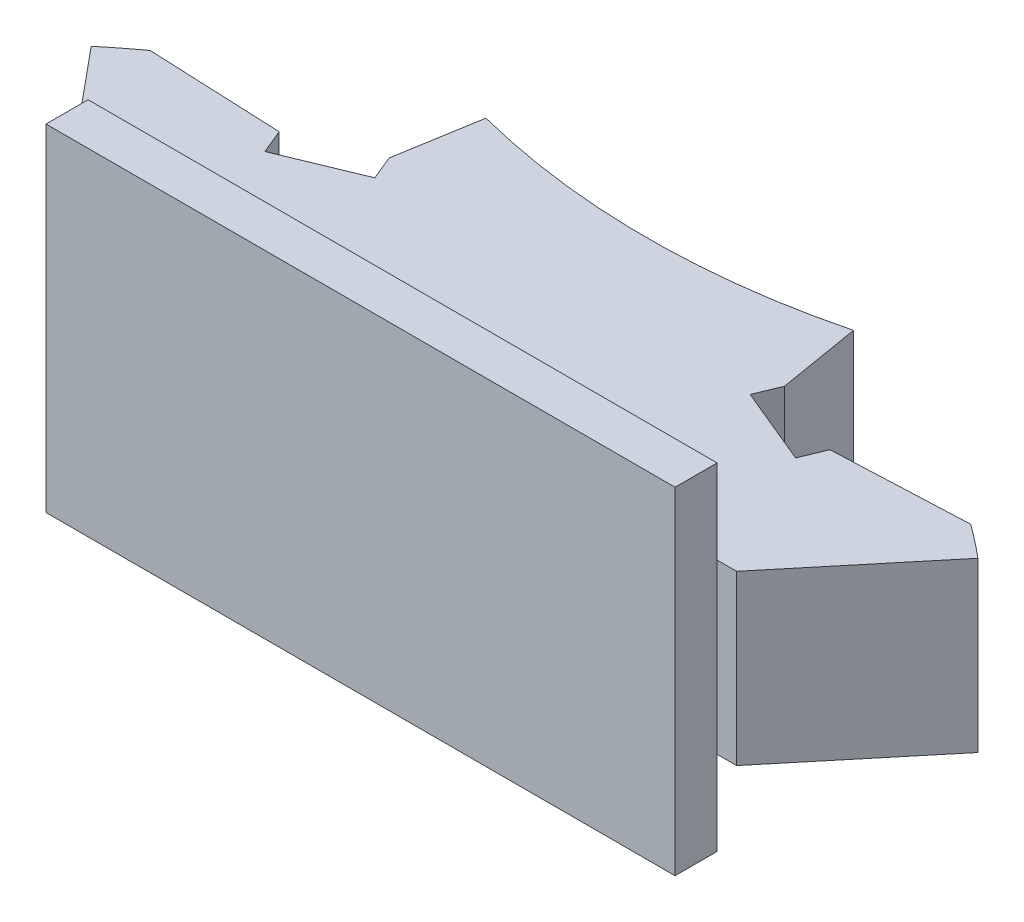
ISO-10303-21;
HEADER;
FILE_DESCRIPTION(('STEP AP214'),'2;1');
FILE_NAME('part.step','',(''),(''),'','','');
FILE_SCHEMA(('AUTOMOTIVE_DESIGN { 1 0 10303 214 1 1 1 1 }'));
ENDSEC;
DATA;
#1=APPLICATION_CONTEXT('core data for automotive mechanical design processes');
#2=APPLICATION_PROTOCOL_DEFINITION('international standard','automotive_design',2000,#1);
#3=PRODUCT_CONTEXT('',#1,'mechanical');
#4=PRODUCT('Part','Part','',(#3));
#5=PRODUCT_RELATED_PRODUCT_CATEGORY('part','',(#4));
#6=PRODUCT_DEFINITION_FORMATION('','',#4);
#7=PRODUCT_DEFINITION_CONTEXT('part definition',#1,'design');
#8=PRODUCT_DEFINITION('design','',#6,#7);
#9=PRODUCT_DEFINITION_SHAPE('','',#8);
#10=(LENGTH_UNIT() NAMED_UNIT(*) SI_UNIT(.MILLI.,.METRE.));
#11=(NAMED_UNIT(*) PLANE_ANGLE_UNIT() SI_UNIT($,.RADIAN.));
#12=(NAMED_UNIT(*) SI_UNIT($,.STERADIAN.) SOLID_ANGLE_UNIT());
#13=UNCERTAINTY_MEASURE_WITH_UNIT(LENGTH_MEASURE(1.E-05),#10,'distance_accuracy_value','');
#14=(GEOMETRIC_REPRESENTATION_CONTEXT(3) GLOBAL_UNCERTAINTY_ASSIGNED_CONTEXT((#13)) GLOBAL_UNIT_ASSIGNED_CONTEXT((#10,
#11,#12)) REPRESENTATION_CONTEXT('',''));
#15=CARTESIAN_POINT('',(0.,0.,0.));
#16=DIRECTION('',(0.,0.,1.));
#17=DIRECTION('',(1.,0.,0.));
#18=AXIS2_PLACEMENT_3D('',#15,#16,#17);
#19=CARTESIAN_POINT('',(-115.533621356237,0.,0.));
#20=DIRECTION('',(0.,1.,0.));
#21=DIRECTION('',(0.,0.,1.));
#22=AXIS2_PLACEMENT_3D('',#19,#20,#21);
#23=PLANE('',#22);
#24=DIRECTION('',(1.,0.,0.));
#25=VECTOR('',#24,1.);
#26=CARTESIAN_POINT('',(-115.533621356237,0.,-30.4184296922719));
#27=LINE('',#26,#25);
#28=CARTESIAN_POINT('',(-25.2117383763098,0.,-30.4184296922719));
#29=VERTEX_POINT('',#28);
#30=CARTESIAN_POINT('',(-23.7417354028187,0.,-30.4184296922719));
#31=VERTEX_POINT('',#30);
#32=EDGE_CURVE('E219',#29,#31,#27,.T.);
#33=ORIENTED_EDGE('',*,*,#32,.T.);
#34=DIRECTION('',(1.,0.,0.));
#35=VECTOR('',#34,1.);
#36=CARTESIAN_POINT('',(-115.533621356237,0.,-30.4184296922719));
#37=LINE('',#36,#35);
#38=CARTESIAN_POINT('',(23.7417354028187,0.,-30.4184296922719));
#39=VERTEX_POINT('',#38);
#40=EDGE_CURVE('E359',#31,#39,#37,.T.);
#41=ORIENTED_EDGE('',*,*,#40,.T.);
#42=CARTESIAN_POINT('',(25.2117383763098,0.,-30.4184296922719));
#43=VERTEX_POINT('',#42);
#44=EDGE_CURVE('E210',#39,#43,#27,.T.);
#45=ORIENTED_EDGE('',*,*,#44,.T.);
#46=DIRECTION('',(0.638136368104806,0.,-0.76992335703108));
#47=VECTOR('',#46,1.);
#48=CARTESIAN_POINT('',(-47.0473730286792,0.,56.7635276599454));
#49=LINE('',#48,#47);
#50=CARTESIAN_POINT('',(33.4708906434651,0.,-40.3832499996372));
#51=VERTEX_POINT('',#50);
#52=EDGE_CURVE('E213',#43,#51,#49,.T.);
#53=ORIENTED_EDGE('',*,*,#52,.T.);
#54=CARTESIAN_POINT('',(0.,0.,0.));
#55=DIRECTION('',(0.,1.,0.));
#56=DIRECTION('',(0.,0.,1.));
#57=AXIS2_PLACEMENT_3D('',#54,#55,#56);
#58=CIRCLE('',#57,52.451);
#59=CARTESIAN_POINT('',(30.9661817647511,0.,-42.3344184784957));
#60=VERTEX_POINT('',#59);
#61=EDGE_CURVE('E262',#51,#60,#58,.T.);
#62=ORIENTED_EDGE('',*,*,#61,.T.);
#63=DIRECTION('',(0.999048221581858,0.,-0.0436193873653331));
#64=VECTOR('',#63,1.);
#65=CARTESIAN_POINT('',(-117.099727209191,0.,-35.8697212800879));
#66=LINE('',#65,#64);
#67=CARTESIAN_POINT('',(20.788013818679,0.,-41.890030068889));
#68=VERTEX_POINT('',#67);
#69=EDGE_CURVE('E260',#68,#60,#66,.T.);
#70=ORIENTED_EDGE('',*,*,#69,.F.);
#71=DIRECTION('',(-0.382683432365091,0.,0.923879532511286));
#72=VECTOR('',#71,1.);
#73=CARTESIAN_POINT('',(-13.9861896043783,0.,42.0623234557764));
#74=LINE('',#73,#72);
#75=CARTESIAN_POINT('',(20.0298414024773,0.,-40.0596399390777));
#76=VERTEX_POINT('',#75);
#77=EDGE_CURVE('E257',#68,#76,#74,.T.);
#78=ORIENTED_EDGE('',*,*,#77,.T.);
#79=DIRECTION('',(0.923879532511286,0.,0.382683432365091));
#80=VECTOR('',#79,1.);
#81=CARTESIAN_POINT('',(-81.5175903493817,0.,-82.1219633948541));
#82=LINE('',#81,#80);
#83=CARTESIAN_POINT('',(14.1632063710306,0.,-42.489679734596));
#84=VERTEX_POINT('',#83);
#85=EDGE_CURVE('E255',#84,#76,#82,.T.);
#86=ORIENTED_EDGE('',*,*,#85,.F.);
#87=DIRECTION('',(-0.382683432365091,0.,0.923879532511286));
#88=VECTOR('',#87,1.);
#89=CARTESIAN_POINT('',(-19.8528246358249,0.,39.6322836602581));
#90=LINE('',#89,#88);
#91=CARTESIAN_POINT('',(14.9213787872323,0.,-44.3200698644074));
#92=VERTEX_POINT('',#91);
#93=EDGE_CURVE('E172',#92,#84,#90,.T.);
#94=ORIENTED_EDGE('',*,*,#93,.F.);
#95=DIRECTION('',(-0.165047605860678,0.,-0.986285601537231));
#96=VECTOR('',#95,1.);
#97=CARTESIAN_POINT('',(18.5822933488122,0.,-22.4433070860841));
#98=LINE('',#97,#96);
#99=CARTESIAN_POINT('',(13.873326490017,0.,-50.5829834341688));
#100=VERTEX_POINT('',#99);
#101=EDGE_CURVE('E251',#92,#100,#98,.T.);
#102=ORIENTED_EDGE('',*,*,#101,.T.);
#103=CARTESIAN_POINT('',(0.,0.,-104.713429692272));
#104=DIRECTION('',(0.,1.,0.));
#105=DIRECTION('',(0.,0.,1.));
#106=AXIS2_PLACEMENT_3D('',#103,#104,#105);
#107=CIRCLE('',#106,55.88);
#108=CARTESIAN_POINT('',(-13.873326490017,0.,-50.5829834341688));
#109=VERTEX_POINT('',#108);
#110=EDGE_CURVE('E188',#109,#100,#107,.T.);
#111=ORIENTED_EDGE('',*,*,#110,.F.);
#112=DIRECTION('',(0.165047605860678,0.,-0.986285601537231));
#113=VECTOR('',#112,1.);
#114=CARTESIAN_POINT('',(-24.8767296064692,0.,15.170760796618));
#115=LINE('',#114,#113);
#116=CARTESIAN_POINT('',(-14.9213787872323,0.,-44.3200698644074));
#117=VERTEX_POINT('',#116);
#118=EDGE_CURVE('E190',#117,#109,#115,.T.);
#119=ORIENTED_EDGE('',*,*,#118,.F.);
#120=DIRECTION('',(0.382683432365091,0.,0.923879532511286));
#121=VECTOR('',#120,1.);
#122=CARTESIAN_POINT('',(-13.9861896043782,0.,-42.0623234557764));
#123=LINE('',#122,#121);
#124=CARTESIAN_POINT('',(-14.1632063710306,0.,-42.489679734596));
#125=VERTEX_POINT('',#124);
#126=EDGE_CURVE('E193',#117,#125,#123,.T.);
#127=ORIENTED_EDGE('',*,*,#126,.T.);
#128=DIRECTION('',(0.923879532511287,0.,-0.382683432365091));
#129=VECTOR('',#128,1.);
#130=CARTESIAN_POINT('',(-115.71063812289,0.,-0.427356278819604));
#131=LINE('',#130,#129);
#132=CARTESIAN_POINT('',(-20.0298414024773,0.,-40.0596399390777));
#133=VERTEX_POINT('',#132);
#134=EDGE_CURVE('E196',#133,#125,#131,.T.);
#135=ORIENTED_EDGE('',*,*,#134,.F.);
#136=DIRECTION('',(0.382683432365091,0.,0.923879532511286));
#137=VECTOR('',#136,1.);
#138=CARTESIAN_POINT('',(-19.8528246358249,0.,-39.6322836602581));
#139=LINE('',#138,#137);
#140=CARTESIAN_POINT('',(-20.788013818679,0.,-41.890030068889));
#141=VERTEX_POINT('',#140);
#142=EDGE_CURVE('E199',#141,#133,#139,.T.);
#143=ORIENTED_EDGE('',*,*,#142,.F.);
#144=DIRECTION('',(-0.999048221581858,0.,-0.0436193873653338));
#145=VECTOR('',#144,1.);
#146=CARTESIAN_POINT('',(-113.527875193469,0.,-45.9391398617168));
#147=LINE('',#146,#145);
#148=CARTESIAN_POINT('',(-30.9661817647511,0.,-42.3344184784957));
#149=VERTEX_POINT('',#148);
#150=EDGE_CURVE('E201',#141,#149,#147,.T.);
#151=ORIENTED_EDGE('',*,*,#150,.T.);
#152=CARTESIAN_POINT('',(0.,0.,0.));
#153=DIRECTION('',(0.,1.,0.));
#154=DIRECTION('',(0.,0.,1.));
#155=AXIS2_PLACEMENT_3D('',#152,#153,#154);
#156=CIRCLE('',#155,52.451);
#157=CARTESIAN_POINT('',(-33.4708906434651,0.,-40.3832499996372));
#158=VERTEX_POINT('',#157);
#159=EDGE_CURVE('E204',#149,#158,#156,.T.);
#160=ORIENTED_EDGE('',*,*,#159,.T.);
#161=DIRECTION('',(-0.638136368104805,0.,-0.769923357031081));
#162=VECTOR('',#161,1.);
#163=CARTESIAN_POINT('',(-47.0473730286791,0.,-56.7635276599454));
#164=LINE('',#163,#162);
#165=EDGE_CURVE('E207',#29,#158,#164,.T.);
#166=ORIENTED_EDGE('',*,*,#165,.F.);
#167=EDGE_LOOP('',(#33,#41,#45,#53,#62,#70,#78,#86,#94,#102,#111,#119,#127,#135,#143,#151,#160,#166));
#168=FACE_BOUND('',#167,.T.);
#169=ADVANCED_FACE('F35',(#168),#23,.T.);
#170=CARTESIAN_POINT('',(-115.533621356237,-12.7,-30.4184296922719));
#171=DIRECTION('',(0.,0.,1.));
#172=DIRECTION('',(1.,0.,0.));
#173=AXIS2_PLACEMENT_3D('',#170,#171,#172);
#174=PLANE('',#173);
#175=DIRECTION('',(1.,0.,0.));
#176=VECTOR('',#175,1.);
#177=CARTESIAN_POINT('',(-115.533621356237,-12.7,-30.4184296922719));
#178=LINE('',#177,#176);
#179=CARTESIAN_POINT('',(-25.2117383763098,-12.7,-30.4184296922719));
#180=VERTEX_POINT('',#179);
#181=CARTESIAN_POINT('',(-23.7417354028187,-12.7,-30.4184296922719));
#182=VERTEX_POINT('',#181);
#183=EDGE_CURVE('E390',#180,#182,#178,.T.);
#184=ORIENTED_EDGE('',*,*,#183,.T.);
#185=DIRECTION('',(0.,1.,0.));
#186=VECTOR('',#185,1.);
#187=CARTESIAN_POINT('',(-23.7417354028187,-19.05,-30.4184296922719));
#188=LINE('',#187,#186);
#189=EDGE_CURVE('E45',#182,#31,#188,.T.);
#190=ORIENTED_EDGE('',*,*,#189,.T.);
#191=ORIENTED_EDGE('',*,*,#32,.F.);
#192=DIRECTION('',(0.,1.,0.));
#193=VECTOR('',#192,1.);
#194=CARTESIAN_POINT('',(-25.2117383763098,-12.7,-30.4184296922719));
#195=LINE('',#194,#193);
#196=EDGE_CURVE('E237',#180,#29,#195,.T.);
#197=ORIENTED_EDGE('',*,*,#196,.F.);
#198=EDGE_LOOP('',(#184,#190,#191,#197));
#199=FACE_BOUND('',#198,.T.);
#200=ADVANCED_FACE('F298',(#199),#174,.T.);
#201=CARTESIAN_POINT('',(0.,-12.7,-104.713429692272));
#202=DIRECTION('',(0.,1.,0.));
#203=DIRECTION('',(0.,0.,1.));
#204=AXIS2_PLACEMENT_3D('',#201,#202,#203);
#205=CYLINDRICAL_SURFACE('',#204,55.88);
#206=ORIENTED_EDGE('',*,*,#110,.T.);
#207=DIRECTION('',(0.,1.,0.));
#208=VECTOR('',#207,1.);
#209=CARTESIAN_POINT('',(13.873326490017,-12.7,-50.5829834341688));
#210=LINE('',#209,#208);
#211=CARTESIAN_POINT('',(13.873326490017,-12.7,-50.5829834341688));
#212=VERTEX_POINT('',#211);
#213=EDGE_CURVE('E114',#212,#100,#210,.T.);
#214=ORIENTED_EDGE('',*,*,#213,.F.);
#215=CARTESIAN_POINT('',(0.,-12.7,-104.713429692272));
#216=DIRECTION('',(0.,1.,0.));
#217=DIRECTION('',(0.,0.,1.));
#218=AXIS2_PLACEMENT_3D('',#215,#216,#217);
#219=CIRCLE('',#218,55.88);
#220=CARTESIAN_POINT('',(-13.873326490017,-12.7,-50.5829834341688));
#221=VERTEX_POINT('',#220);
#222=EDGE_CURVE('E54',#221,#212,#219,.T.);
#223=ORIENTED_EDGE('',*,*,#222,.F.);
#224=DIRECTION('',(0.,1.,0.));
#225=VECTOR('',#224,1.);
#226=CARTESIAN_POINT('',(-13.873326490017,-12.7,-50.5829834341688));
#227=LINE('',#226,#225);
#228=EDGE_CURVE('E187',#221,#109,#227,.T.);
#229=ORIENTED_EDGE('',*,*,#228,.T.);
#230=EDGE_LOOP('',(#206,#214,#223,#229));
#231=FACE_BOUND('',#230,.T.);
#232=ADVANCED_FACE('F37',(#231),#205,.F.);
#233=CARTESIAN_POINT('',(18.5822933488122,-12.7,-22.4433070860841));
#234=DIRECTION('',(0.986285601537231,0.,-0.165047605860678));
#235=DIRECTION('',(-0.165047605860678,0.,-0.986285601537231));
#236=AXIS2_PLACEMENT_3D('',#233,#234,#235);
#237=PLANE('',#236);
#238=ORIENTED_EDGE('',*,*,#101,.F.);
#239=DIRECTION('',(0.,1.,0.));
#240=VECTOR('',#239,1.);
#241=CARTESIAN_POINT('',(14.9213787872323,-12.7,-44.3200698644074));
#242=LINE('',#241,#240);
#243=CARTESIAN_POINT('',(14.9213787872323,-12.7,-44.3200698644074));
#244=VERTEX_POINT('',#243);
#245=EDGE_CURVE('E107',#244,#92,#242,.T.);
#246=ORIENTED_EDGE('',*,*,#245,.F.);
#247=DIRECTION('',(-0.165047605860678,0.,-0.986285601537231));
#248=VECTOR('',#247,1.);
#249=CARTESIAN_POINT('',(18.5822933488122,-12.7,-22.4433070860841));
#250=LINE('',#249,#248);
#251=EDGE_CURVE('E167',#244,#212,#250,.T.);
#252=ORIENTED_EDGE('',*,*,#251,.T.);
#253=ORIENTED_EDGE('',*,*,#213,.T.);
#254=EDGE_LOOP('',(#238,#246,#252,#253));
#255=FACE_BOUND('',#254,.T.);
#256=ADVANCED_FACE('F290',(#255),#237,.T.);
#257=CARTESIAN_POINT('',(-19.8528246358249,-12.7,39.6322836602581));
#258=DIRECTION('',(-0.923879532511286,0.,-0.382683432365091));
#259=DIRECTION('',(-0.382683432365091,0.,0.923879532511286));
#260=AXIS2_PLACEMENT_3D('',#257,#258,#259);
#261=PLANE('',#260);
#262=ORIENTED_EDGE('',*,*,#93,.T.);
#263=DIRECTION('',(0.,1.,0.));
#264=VECTOR('',#263,1.);
#265=CARTESIAN_POINT('',(14.1632063710306,-12.7,-42.489679734596));
#266=LINE('',#265,#264);
#267=CARTESIAN_POINT('',(14.1632063710306,-12.7,-42.489679734596));
#268=VERTEX_POINT('',#267);
#269=EDGE_CURVE('E170',#268,#84,#266,.T.);
#270=ORIENTED_EDGE('',*,*,#269,.F.);
#271=DIRECTION('',(-0.382683432365091,0.,0.923879532511286));
#272=VECTOR('',#271,1.);
#273=CARTESIAN_POINT('',(-19.8528246358249,-12.7,39.6322836602581));
#274=LINE('',#273,#272);
#275=EDGE_CURVE('E160',#244,#268,#274,.T.);
#276=ORIENTED_EDGE('',*,*,#275,.F.);
#277=ORIENTED_EDGE('',*,*,#245,.T.);
#278=EDGE_LOOP('',(#262,#270,#276,#277));
#279=FACE_BOUND('',#278,.T.);
#280=ADVANCED_FACE('F171',(#279),#261,.F.);
#281=CARTESIAN_POINT('',(-81.5175903493817,-12.7,-82.1219633948541));
#282=DIRECTION('',(-0.382683432365091,0.,0.923879532511286));
#283=DIRECTION('',(0.923879532511286,0.,0.382683432365091));
#284=AXIS2_PLACEMENT_3D('',#281,#282,#283);
#285=PLANE('',#284);
#286=ORIENTED_EDGE('',*,*,#85,.T.);
#287=DIRECTION('',(0.,1.,0.));
#288=VECTOR('',#287,1.);
#289=CARTESIAN_POINT('',(20.0298414024773,-12.7,-40.0596399390777));
#290=LINE('',#289,#288);
#291=CARTESIAN_POINT('',(20.0298414024773,-12.7,-40.0596399390777));
#292=VERTEX_POINT('',#291);
#293=EDGE_CURVE('E176',#292,#76,#290,.T.);
#294=ORIENTED_EDGE('',*,*,#293,.F.);
#295=DIRECTION('',(0.923879532511286,0.,0.382683432365091));
#296=VECTOR('',#295,1.);
#297=CARTESIAN_POINT('',(-81.5175903493817,-12.7,-82.1219633948541));
#298=LINE('',#297,#296);
#299=EDGE_CURVE('E165',#268,#292,#298,.T.);
#300=ORIENTED_EDGE('',*,*,#299,.F.);
#301=ORIENTED_EDGE('',*,*,#269,.T.);
#302=EDGE_LOOP('',(#286,#294,#300,#301));
#303=FACE_BOUND('',#302,.T.);
#304=ADVANCED_FACE('F178',(#303),#285,.F.);
#305=CARTESIAN_POINT('',(-13.9861896043783,-12.7,42.0623234557764));
#306=DIRECTION('',(-0.923879532511286,0.,-0.382683432365091));
#307=DIRECTION('',(-0.382683432365091,0.,0.923879532511286));
#308=AXIS2_PLACEMENT_3D('',#305,#306,#307);
#309=PLANE('',#308);
#310=ORIENTED_EDGE('',*,*,#77,.F.);
#311=DIRECTION('',(0.,1.,0.));
#312=VECTOR('',#311,1.);
#313=CARTESIAN_POINT('',(20.788013818679,-12.7,-41.890030068889));
#314=LINE('',#313,#312);
#315=CARTESIAN_POINT('',(20.788013818679,-12.7,-41.890030068889));
#316=VERTEX_POINT('',#315);
#317=EDGE_CURVE('E246',#316,#68,#314,.T.);
#318=ORIENTED_EDGE('',*,*,#317,.F.);
#319=DIRECTION('',(-0.382683432365091,0.,0.923879532511286));
#320=VECTOR('',#319,1.);
#321=CARTESIAN_POINT('',(-13.9861896043783,-12.7,42.0623234557764));
#322=LINE('',#321,#320);
#323=EDGE_CURVE('E180',#316,#292,#322,.T.);
#324=ORIENTED_EDGE('',*,*,#323,.T.);
#325=ORIENTED_EDGE('',*,*,#293,.T.);
#326=EDGE_LOOP('',(#310,#318,#324,#325));
#327=FACE_BOUND('',#326,.T.);
#328=ADVANCED_FACE('F288',(#327),#309,.T.);
#329=CARTESIAN_POINT('',(-117.099727209191,-12.7,-35.8697212800879));
#330=DIRECTION('',(0.0436193873653331,0.,0.999048221581858));
#331=DIRECTION('',(0.999048221581858,0.,-0.0436193873653331));
#332=AXIS2_PLACEMENT_3D('',#329,#330,#331);
#333=PLANE('',#332);
#334=ORIENTED_EDGE('',*,*,#69,.T.);
#335=DIRECTION('',(0.,1.,0.));
#336=VECTOR('',#335,1.);
#337=CARTESIAN_POINT('',(30.9661817647511,-12.7,-42.3344184784957));
#338=LINE('',#337,#336);
#339=CARTESIAN_POINT('',(30.9661817647511,-12.7,-42.3344184784957));
#340=VERTEX_POINT('',#339);
#341=EDGE_CURVE('E244',#340,#60,#338,.T.);
#342=ORIENTED_EDGE('',*,*,#341,.F.);
#343=DIRECTION('',(0.999048221581858,0.,-0.0436193873653331));
#344=VECTOR('',#343,1.);
#345=CARTESIAN_POINT('',(-117.099727209191,-12.7,-35.8697212800879));
#346=LINE('',#345,#344);
#347=EDGE_CURVE('E182',#316,#340,#346,.T.);
#348=ORIENTED_EDGE('',*,*,#347,.F.);
#349=ORIENTED_EDGE('',*,*,#317,.T.);
#350=EDGE_LOOP('',(#334,#342,#348,#349));
#351=FACE_BOUND('',#350,.T.);
#352=ADVANCED_FACE('F285',(#351),#333,.F.);
#353=CARTESIAN_POINT('',(0.,-12.7,0.));
#354=DIRECTION('',(0.,1.,0.));
#355=DIRECTION('',(0.,0.,1.));
#356=AXIS2_PLACEMENT_3D('',#353,#354,#355);
#357=CYLINDRICAL_SURFACE('',#356,52.451);
#358=ORIENTED_EDGE('',*,*,#61,.F.);
#359=DIRECTION('',(0.,1.,0.));
#360=VECTOR('',#359,1.);
#361=CARTESIAN_POINT('',(33.4708906434651,-12.7,-40.3832499996372));
#362=LINE('',#361,#360);
#363=CARTESIAN_POINT('',(33.4708906434651,-12.7,-40.3832499996372));
#364=VERTEX_POINT('',#363);
#365=EDGE_CURVE('E242',#364,#51,#362,.T.);
#366=ORIENTED_EDGE('',*,*,#365,.F.);
#367=CARTESIAN_POINT('',(0.,-12.7,0.));
#368=DIRECTION('',(0.,1.,0.));
#369=DIRECTION('',(0.,0.,1.));
#370=AXIS2_PLACEMENT_3D('',#367,#368,#369);
#371=CIRCLE('',#370,52.451);
#372=EDGE_CURVE('E282',#364,#340,#371,.T.);
#373=ORIENTED_EDGE('',*,*,#372,.T.);
#374=ORIENTED_EDGE('',*,*,#341,.T.);
#375=EDGE_LOOP('',(#358,#366,#373,#374));
#376=FACE_BOUND('',#375,.T.);
#377=ADVANCED_FACE('F280',(#376),#357,.T.);
#378=CARTESIAN_POINT('',(-47.0473730286792,-12.7,56.7635276599454));
#379=DIRECTION('',(0.76992335703108,0.,0.638136368104805));
#380=DIRECTION('',(0.638136368104805,0.,-0.76992335703108));
#381=AXIS2_PLACEMENT_3D('',#378,#379,#380);
#382=PLANE('',#381);
#383=ORIENTED_EDGE('',*,*,#52,.F.);
#384=DIRECTION('',(0.,1.,0.));
#385=VECTOR('',#384,1.);
#386=CARTESIAN_POINT('',(25.2117383763098,-12.7,-30.4184296922719));
#387=LINE('',#386,#385);
#388=CARTESIAN_POINT('',(25.2117383763098,-12.7,-30.4184296922719));
#389=VERTEX_POINT('',#388);
#390=EDGE_CURVE('E239',#389,#43,#387,.T.);
#391=ORIENTED_EDGE('',*,*,#390,.F.);
#392=DIRECTION('',(0.638136368104806,0.,-0.76992335703108));
#393=VECTOR('',#392,1.);
#394=CARTESIAN_POINT('',(-47.0473730286792,-12.7,56.7635276599454));
#395=LINE('',#394,#393);
#396=EDGE_CURVE('E276',#389,#364,#395,.T.);
#397=ORIENTED_EDGE('',*,*,#396,.T.);
#398=ORIENTED_EDGE('',*,*,#365,.T.);
#399=EDGE_LOOP('',(#383,#391,#397,#398));
#400=FACE_BOUND('',#399,.T.);
#401=ADVANCED_FACE('F273',(#400),#382,.T.);
#402=DIRECTION('',(0.,1.,0.));
#403=VECTOR('',#402,1.);
#404=CARTESIAN_POINT('',(23.7417354028187,-19.05,-30.4184296922719));
#405=LINE('',#404,#403);
#406=CARTESIAN_POINT('',(23.7417354028187,-12.7,-30.4184296922719));
#407=VERTEX_POINT('',#406);
#408=EDGE_CURVE('E11',#407,#39,#405,.T.);
#409=ORIENTED_EDGE('',*,*,#408,.F.);
#410=EDGE_CURVE('E400',#407,#389,#178,.T.);
#411=ORIENTED_EDGE('',*,*,#410,.T.);
#412=ORIENTED_EDGE('',*,*,#390,.T.);
#413=ORIENTED_EDGE('',*,*,#44,.F.);
#414=EDGE_LOOP('',(#409,#411,#412,#413));
#415=FACE_BOUND('',#414,.T.);
#416=ADVANCED_FACE('F307',(#415),#174,.T.);
#417=CARTESIAN_POINT('',(-47.0473730286791,-12.7,-56.7635276599454));
#418=DIRECTION('',(0.76992335703108,0.,-0.638136368104805));
#419=DIRECTION('',(-0.638136368104805,0.,-0.769923357031081));
#420=AXIS2_PLACEMENT_3D('',#417,#418,#419);
#421=PLANE('',#420);
#422=ORIENTED_EDGE('',*,*,#165,.T.);
#423=DIRECTION('',(0.,1.,0.));
#424=VECTOR('',#423,1.);
#425=CARTESIAN_POINT('',(-33.4708906434651,-12.7,-40.3832499996372));
#426=LINE('',#425,#424);
#427=CARTESIAN_POINT('',(-33.4708906434651,-12.7,-40.3832499996372));
#428=VERTEX_POINT('',#427);
#429=EDGE_CURVE('E235',#428,#158,#426,.T.);
#430=ORIENTED_EDGE('',*,*,#429,.F.);
#431=DIRECTION('',(-0.638136368104805,0.,-0.769923357031081));
#432=VECTOR('',#431,1.);
#433=CARTESIAN_POINT('',(-47.0473730286791,-12.7,-56.7635276599454));
#434=LINE('',#433,#432);
#435=EDGE_CURVE('E398',#180,#428,#434,.T.);
#436=ORIENTED_EDGE('',*,*,#435,.F.);
#437=ORIENTED_EDGE('',*,*,#196,.T.);
#438=EDGE_LOOP('',(#422,#430,#436,#437));
#439=FACE_BOUND('',#438,.T.);
#440=ADVANCED_FACE('F395',(#439),#421,.F.);
#441=CARTESIAN_POINT('',(0.,-12.7,0.));
#442=DIRECTION('',(0.,1.,0.));
#443=DIRECTION('',(0.,0.,1.));
#444=AXIS2_PLACEMENT_3D('',#441,#442,#443);
#445=CYLINDRICAL_SURFACE('',#444,52.451);
#446=ORIENTED_EDGE('',*,*,#159,.F.);
#447=DIRECTION('',(0.,1.,0.));
#448=VECTOR('',#447,1.);
#449=CARTESIAN_POINT('',(-30.9661817647511,-12.7,-42.3344184784957));
#450=LINE('',#449,#448);
#451=CARTESIAN_POINT('',(-30.9661817647511,-12.7,-42.3344184784957));
#452=VERTEX_POINT('',#451);
#453=EDGE_CURVE('E233',#452,#149,#450,.T.);
#454=ORIENTED_EDGE('',*,*,#453,.F.);
#455=CARTESIAN_POINT('',(0.,-12.7,0.));
#456=DIRECTION('',(0.,1.,0.));
#457=DIRECTION('',(0.,0.,1.));
#458=AXIS2_PLACEMENT_3D('',#455,#456,#457);
#459=CIRCLE('',#458,52.451);
#460=EDGE_CURVE('E401',#452,#428,#459,.T.);
#461=ORIENTED_EDGE('',*,*,#460,.T.);
#462=ORIENTED_EDGE('',*,*,#429,.T.);
#463=EDGE_LOOP('',(#446,#454,#461,#462));
#464=FACE_BOUND('',#463,.T.);
#465=ADVANCED_FACE('F458',(#464),#445,.T.);
#466=CARTESIAN_POINT('',(-113.527875193469,-12.7,-45.9391398617168));
#467=DIRECTION('',(0.0436193873653338,0.,-0.999048221581858));
#468=DIRECTION('',(-0.999048221581858,0.,-0.0436193873653338));
#469=AXIS2_PLACEMENT_3D('',#466,#467,#468);
#470=PLANE('',#469);
#471=ORIENTED_EDGE('',*,*,#150,.F.);
#472=DIRECTION('',(0.,1.,0.));
#473=VECTOR('',#472,1.);
#474=CARTESIAN_POINT('',(-20.788013818679,-12.7,-41.890030068889));
#475=LINE('',#474,#473);
#476=CARTESIAN_POINT('',(-20.788013818679,-12.7,-41.890030068889));
#477=VERTEX_POINT('',#476);
#478=EDGE_CURVE('E231',#477,#141,#475,.T.);
#479=ORIENTED_EDGE('',*,*,#478,.F.);
#480=DIRECTION('',(-0.999048221581858,0.,-0.0436193873653338));
#481=VECTOR('',#480,1.);
#482=CARTESIAN_POINT('',(-113.527875193469,-12.7,-45.9391398617168));
#483=LINE('',#482,#481);
#484=EDGE_CURVE('E454',#477,#452,#483,.T.);
#485=ORIENTED_EDGE('',*,*,#484,.T.);
#486=ORIENTED_EDGE('',*,*,#453,.T.);
#487=EDGE_LOOP('',(#471,#479,#485,#486));
#488=FACE_BOUND('',#487,.T.);
#489=ADVANCED_FACE('F462',(#488),#470,.T.);
#490=CARTESIAN_POINT('',(-19.8528246358249,-12.7,-39.6322836602581));
#491=DIRECTION('',(-0.923879532511286,0.,0.382683432365091));
#492=DIRECTION('',(0.382683432365091,0.,0.923879532511286));
#493=AXIS2_PLACEMENT_3D('',#490,#491,#492);
#494=PLANE('',#493);
#495=ORIENTED_EDGE('',*,*,#142,.T.);
#496=DIRECTION('',(0.,1.,0.));
#497=VECTOR('',#496,1.);
#498=CARTESIAN_POINT('',(-20.0298414024773,-12.7,-40.0596399390777));
#499=LINE('',#498,#497);
#500=CARTESIAN_POINT('',(-20.0298414024773,-12.7,-40.0596399390777));
#501=VERTEX_POINT('',#500);
#502=EDGE_CURVE('E228',#501,#133,#499,.T.);
#503=ORIENTED_EDGE('',*,*,#502,.F.);
#504=DIRECTION('',(0.382683432365091,0.,0.923879532511286));
#505=VECTOR('',#504,1.);
#506=CARTESIAN_POINT('',(-19.8528246358249,-12.7,-39.6322836602581));
#507=LINE('',#506,#505);
#508=EDGE_CURVE('E452',#477,#501,#507,.T.);
#509=ORIENTED_EDGE('',*,*,#508,.F.);
#510=ORIENTED_EDGE('',*,*,#478,.T.);
#511=EDGE_LOOP('',(#495,#503,#509,#510));
#512=FACE_BOUND('',#511,.T.);
#513=ADVANCED_FACE('F467',(#512),#494,.F.);
#514=CARTESIAN_POINT('',(-115.71063812289,-12.7,-0.427356278819604));
#515=DIRECTION('',(0.382683432365091,0.,0.923879532511286));
#516=DIRECTION('',(0.923879532511287,0.,-0.382683432365091));
#517=AXIS2_PLACEMENT_3D('',#514,#515,#516);
#518=PLANE('',#517);
#519=ORIENTED_EDGE('',*,*,#134,.T.);
#520=DIRECTION('',(0.,1.,0.));
#521=VECTOR('',#520,1.);
#522=CARTESIAN_POINT('',(-14.1632063710306,-12.7,-42.489679734596));
#523=LINE('',#522,#521);
#524=CARTESIAN_POINT('',(-14.1632063710306,-12.7,-42.489679734596));
#525=VERTEX_POINT('',#524);
#526=EDGE_CURVE('E226',#525,#125,#523,.T.);
#527=ORIENTED_EDGE('',*,*,#526,.F.);
#528=DIRECTION('',(0.923879532511287,0.,-0.382683432365091));
#529=VECTOR('',#528,1.);
#530=CARTESIAN_POINT('',(-115.71063812289,-12.7,-0.427356278819604));
#531=LINE('',#530,#529);
#532=EDGE_CURVE('E450',#501,#525,#531,.T.);
#533=ORIENTED_EDGE('',*,*,#532,.F.);
#534=ORIENTED_EDGE('',*,*,#502,.T.);
#535=EDGE_LOOP('',(#519,#527,#533,#534));
#536=FACE_BOUND('',#535,.T.);
#537=ADVANCED_FACE('F471',(#536),#518,.F.);
#538=CARTESIAN_POINT('',(-13.9861896043782,-12.7,-42.0623234557764));
#539=DIRECTION('',(-0.923879532511286,0.,0.382683432365091));
#540=DIRECTION('',(0.382683432365091,0.,0.923879532511286));
#541=AXIS2_PLACEMENT_3D('',#538,#539,#540);
#542=PLANE('',#541);
#543=ORIENTED_EDGE('',*,*,#126,.F.);
#544=DIRECTION('',(0.,1.,0.));
#545=VECTOR('',#544,1.);
#546=CARTESIAN_POINT('',(-14.9213787872323,-12.7,-44.3200698644074));
#547=LINE('',#546,#545);
#548=CARTESIAN_POINT('',(-14.9213787872323,-12.7,-44.3200698644074));
#549=VERTEX_POINT('',#548);
#550=EDGE_CURVE('E224',#549,#117,#547,.T.);
#551=ORIENTED_EDGE('',*,*,#550,.F.);
#552=DIRECTION('',(0.382683432365091,0.,0.923879532511286));
#553=VECTOR('',#552,1.);
#554=CARTESIAN_POINT('',(-13.9861896043782,-12.7,-42.0623234557764));
#555=LINE('',#554,#553);
#556=EDGE_CURVE('E447',#549,#525,#555,.T.);
#557=ORIENTED_EDGE('',*,*,#556,.T.);
#558=ORIENTED_EDGE('',*,*,#526,.T.);
#559=EDGE_LOOP('',(#543,#551,#557,#558));
#560=FACE_BOUND('',#559,.T.);
#561=ADVANCED_FACE('F475',(#560),#542,.T.);
#562=CARTESIAN_POINT('',(-24.8767296064692,-12.7,15.170760796618));
#563=DIRECTION('',(0.986285601537231,0.,0.165047605860678));
#564=DIRECTION('',(0.165047605860678,0.,-0.986285601537231));
#565=AXIS2_PLACEMENT_3D('',#562,#563,#564);
#566=PLANE('',#565);
#567=ORIENTED_EDGE('',*,*,#118,.T.);
#568=ORIENTED_EDGE('',*,*,#228,.F.);
#569=DIRECTION('',(0.165047605860678,0.,-0.986285601537231));
#570=VECTOR('',#569,1.);
#571=CARTESIAN_POINT('',(-24.8767296064692,-12.7,15.170760796618));
#572=LINE('',#571,#570);
#573=EDGE_CURVE('E120',#549,#221,#572,.T.);
#574=ORIENTED_EDGE('',*,*,#573,.F.);
#575=ORIENTED_EDGE('',*,*,#550,.T.);
#576=EDGE_LOOP('',(#567,#568,#574,#575));
#577=FACE_BOUND('',#576,.T.);
#578=ADVANCED_FACE('F312',(#577),#566,.F.);
#579=CARTESIAN_POINT('',(-115.533621356237,-12.7,0.));
#580=DIRECTION('',(0.,1.,0.));
#581=DIRECTION('',(0.,0.,1.));
#582=AXIS2_PLACEMENT_3D('',#579,#580,#581);
#583=PLANE('',#582);
#584=ORIENTED_EDGE('',*,*,#222,.T.);
#585=ORIENTED_EDGE('',*,*,#251,.F.);
#586=ORIENTED_EDGE('',*,*,#275,.T.);
#587=ORIENTED_EDGE('',*,*,#299,.T.);
#588=ORIENTED_EDGE('',*,*,#323,.F.);
#589=ORIENTED_EDGE('',*,*,#347,.T.);
#590=ORIENTED_EDGE('',*,*,#372,.F.);
#591=ORIENTED_EDGE('',*,*,#396,.F.);
#592=ORIENTED_EDGE('',*,*,#410,.F.);
#593=EDGE_CURVE('E406',#182,#407,#178,.T.);
#594=ORIENTED_EDGE('',*,*,#593,.F.);
#595=ORIENTED_EDGE('',*,*,#183,.F.);
#596=ORIENTED_EDGE('',*,*,#435,.T.);
#597=ORIENTED_EDGE('',*,*,#460,.F.);
#598=ORIENTED_EDGE('',*,*,#484,.F.);
#599=ORIENTED_EDGE('',*,*,#508,.T.);
#600=ORIENTED_EDGE('',*,*,#532,.T.);
#601=ORIENTED_EDGE('',*,*,#556,.F.);
#602=ORIENTED_EDGE('',*,*,#573,.T.);
#603=EDGE_LOOP('',(#584,#585,#586,#587,#588,#589,#590,#591,#592,#594,#595,#596,#597,#598,#599,
#600,#601,#602));
#604=FACE_BOUND('',#603,.T.);
#605=ADVANCED_FACE('F162',(#604),#583,.F.);
#606=CARTESIAN_POINT('',(-115.533621356237,-19.05,-30.4184296922719));
#607=DIRECTION('',(0.,0.,1.));
#608=DIRECTION('',(1.,0.,0.));
#609=AXIS2_PLACEMENT_3D('',#606,#607,#608);
#610=PLANE('',#609);
#611=CARTESIAN_POINT('',(-23.7417354028187,-19.05,-30.4184296922719));
#612=VERTEX_POINT('',#611);
#613=EDGE_CURVE('E191',#612,#182,#188,.T.);
#614=ORIENTED_EDGE('',*,*,#613,.T.);
#615=ORIENTED_EDGE('',*,*,#593,.T.);
#616=CARTESIAN_POINT('',(23.7417354028187,-19.05,-30.4184296922719));
#617=VERTEX_POINT('',#616);
#618=EDGE_CURVE('E437',#617,#407,#405,.T.);
#619=ORIENTED_EDGE('',*,*,#618,.F.);
#620=DIRECTION('',(1.,0.,0.));
#621=VECTOR('',#620,1.);
#622=CARTESIAN_POINT('',(-115.533621356237,-19.05,-30.4184296922719));
#623=LINE('',#622,#621);
#624=EDGE_CURVE('E440',#612,#617,#623,.T.);
#625=ORIENTED_EDGE('',*,*,#624,.F.);
#626=EDGE_LOOP('',(#614,#615,#619,#625));
#627=FACE_BOUND('',#626,.T.);
#628=ADVANCED_FACE('F311',(#627),#610,.F.);
#629=CARTESIAN_POINT('',(-23.7417354028187,-19.05,0.));
#630=DIRECTION('',(-1.,0.,0.));
#631=DIRECTION('',(0.,0.,1.));
#632=AXIS2_PLACEMENT_3D('',#629,#630,#631);
#633=PLANE('',#632);
#634=DIRECTION('',(0.,1.,0.));
#635=VECTOR('',#634,1.);
#636=CARTESIAN_POINT('',(-23.7417354028187,-19.05,-27.2434296922719));
#637=LINE('',#636,#635);
#638=CARTESIAN_POINT('',(-23.7417354028187,-19.05,-27.2434296922719));
#639=VERTEX_POINT('',#638);
#640=CARTESIAN_POINT('',(-23.7417354028187,6.35,-27.2434296922719));
#641=VERTEX_POINT('',#640);
#642=EDGE_CURVE('E438',#639,#641,#637,.T.);
#643=ORIENTED_EDGE('',*,*,#642,.T.);
#644=DIRECTION('',(0.,0.,1.));
#645=VECTOR('',#644,1.);
#646=CARTESIAN_POINT('',(-23.7417354028187,6.35,0.));
#647=LINE('',#646,#645);
#648=CARTESIAN_POINT('',(-23.7417354028187,6.35,-30.4184296922719));
#649=VERTEX_POINT('',#648);
#650=EDGE_CURVE('E346',#649,#641,#647,.T.);
#651=ORIENTED_EDGE('',*,*,#650,.F.);
#652=DIRECTION('',(0.,-1.,0.));
#653=VECTOR('',#652,1.);
#654=CARTESIAN_POINT('',(-23.7417354028187,6.35,-30.4184296922719));
#655=LINE('',#654,#653);
#656=EDGE_CURVE('E367',#649,#31,#655,.T.);
#657=ORIENTED_EDGE('',*,*,#656,.T.);
#658=ORIENTED_EDGE('',*,*,#189,.F.);
#659=ORIENTED_EDGE('',*,*,#613,.F.);
#660=DIRECTION('',(0.,0.,1.));
#661=VECTOR('',#660,1.);
#662=CARTESIAN_POINT('',(-23.7417354028187,-19.05,0.));
#663=LINE('',#662,#661);
#664=EDGE_CURVE('E370',#612,#639,#663,.T.);
#665=ORIENTED_EDGE('',*,*,#664,.T.);
#666=EDGE_LOOP('',(#643,#651,#657,#658,#659,#665));
#667=FACE_BOUND('',#666,.T.);
#668=ADVANCED_FACE('F313',(#667),#633,.T.);
#669=CARTESIAN_POINT('',(23.7417354028187,-19.05,0.));
#670=DIRECTION('',(-1.,0.,0.));
#671=DIRECTION('',(0.,0.,1.));
#672=AXIS2_PLACEMENT_3D('',#669,#670,#671);
#673=PLANE('',#672);
#674=ORIENTED_EDGE('',*,*,#408,.T.);
#675=DIRECTION('',(0.,-1.,0.));
#676=VECTOR('',#675,1.);
#677=CARTESIAN_POINT('',(23.7417354028187,6.35,-30.4184296922719));
#678=LINE('',#677,#676);
#679=CARTESIAN_POINT('',(23.7417354028187,6.35,-30.4184296922719));
#680=VERTEX_POINT('',#679);
#681=EDGE_CURVE('E374',#680,#39,#678,.T.);
#682=ORIENTED_EDGE('',*,*,#681,.F.);
#683=DIRECTION('',(0.,0.,1.));
#684=VECTOR('',#683,1.);
#685=CARTESIAN_POINT('',(23.7417354028187,6.35,0.));
#686=LINE('',#685,#684);
#687=CARTESIAN_POINT('',(23.7417354028187,6.35,-27.2434296922719));
#688=VERTEX_POINT('',#687);
#689=EDGE_CURVE('E361',#680,#688,#686,.T.);
#690=ORIENTED_EDGE('',*,*,#689,.T.);
#691=DIRECTION('',(0.,1.,0.));
#692=VECTOR('',#691,1.);
#693=CARTESIAN_POINT('',(23.7417354028187,-19.05,-27.2434296922719));
#694=LINE('',#693,#692);
#695=CARTESIAN_POINT('',(23.7417354028187,-19.05,-27.2434296922719));
#696=VERTEX_POINT('',#695);
#697=EDGE_CURVE('E433',#696,#688,#694,.T.);
#698=ORIENTED_EDGE('',*,*,#697,.F.);
#699=DIRECTION('',(0.,0.,1.));
#700=VECTOR('',#699,1.);
#701=CARTESIAN_POINT('',(23.7417354028187,-19.05,0.));
#702=LINE('',#701,#700);
#703=EDGE_CURVE('E730',#617,#696,#702,.T.);
#704=ORIENTED_EDGE('',*,*,#703,.F.);
#705=ORIENTED_EDGE('',*,*,#618,.T.);
#706=EDGE_LOOP('',(#674,#682,#690,#698,#704,#705));
#707=FACE_BOUND('',#706,.T.);
#708=ADVANCED_FACE('F316',(#707),#673,.F.);
#709=CARTESIAN_POINT('',(-115.533621356237,-19.05,-27.2434296922719));
#710=DIRECTION('',(0.,0.,1.));
#711=DIRECTION('',(1.,0.,0.));
#712=AXIS2_PLACEMENT_3D('',#709,#710,#711);
#713=PLANE('',#712);
#714=ORIENTED_EDGE('',*,*,#697,.T.);
#715=DIRECTION('',(1.,0.,0.));
#716=VECTOR('',#715,1.);
#717=CARTESIAN_POINT('',(-115.533621356237,6.35,-27.2434296922719));
#718=LINE('',#717,#716);
#719=EDGE_CURVE('E350',#641,#688,#718,.T.);
#720=ORIENTED_EDGE('',*,*,#719,.F.);
#721=ORIENTED_EDGE('',*,*,#642,.F.);
#722=DIRECTION('',(1.,0.,0.));
#723=VECTOR('',#722,1.);
#724=CARTESIAN_POINT('',(-115.533621356237,-19.05,-27.2434296922719));
#725=LINE('',#724,#723);
#726=EDGE_CURVE('E435',#639,#696,#725,.T.);
#727=ORIENTED_EDGE('',*,*,#726,.T.);
#728=EDGE_LOOP('',(#714,#720,#721,#727));
#729=FACE_BOUND('',#728,.T.);
#730=ADVANCED_FACE('F318',(#729),#713,.T.);
#731=CARTESIAN_POINT('',(-115.533621356237,-19.05,0.));
#732=DIRECTION('',(0.,1.,0.));
#733=DIRECTION('',(0.,0.,1.));
#734=AXIS2_PLACEMENT_3D('',#731,#732,#733);
#735=PLANE('',#734);
#736=ORIENTED_EDGE('',*,*,#664,.F.);
#737=ORIENTED_EDGE('',*,*,#624,.T.);
#738=ORIENTED_EDGE('',*,*,#703,.T.);
#739=ORIENTED_EDGE('',*,*,#726,.F.);
#740=EDGE_LOOP('',(#736,#737,#738,#739));
#741=FACE_BOUND('',#740,.T.);
#742=ADVANCED_FACE('F321',(#741),#735,.F.);
#743=CARTESIAN_POINT('',(-115.533621356237,6.35,-30.4184296922719));
#744=DIRECTION('',(0.,0.,-1.));
#745=DIRECTION('',(-1.,0.,0.));
#746=AXIS2_PLACEMENT_3D('',#743,#744,#745);
#747=PLANE('',#746);
#748=ORIENTED_EDGE('',*,*,#40,.F.);
#749=ORIENTED_EDGE('',*,*,#656,.F.);
#750=DIRECTION('',(1.,0.,0.));
#751=VECTOR('',#750,1.);
#752=CARTESIAN_POINT('',(-115.533621356237,6.35,-30.4184296922719));
#753=LINE('',#752,#751);
#754=EDGE_CURVE('E354',#649,#680,#753,.T.);
#755=ORIENTED_EDGE('',*,*,#754,.T.);
#756=ORIENTED_EDGE('',*,*,#681,.T.);
#757=EDGE_LOOP('',(#748,#749,#755,#756));
#758=FACE_BOUND('',#757,.T.);
#759=ADVANCED_FACE('F331',(#758),#747,.T.);
#760=CARTESIAN_POINT('',(-115.533621356237,6.35,0.));
#761=DIRECTION('',(0.,1.,0.));
#762=DIRECTION('',(0.,0.,1.));
#763=AXIS2_PLACEMENT_3D('',#760,#761,#762);
#764=PLANE('',#763);
#765=ORIENTED_EDGE('',*,*,#650,.T.);
#766=ORIENTED_EDGE('',*,*,#719,.T.);
#767=ORIENTED_EDGE('',*,*,#689,.F.);
#768=ORIENTED_EDGE('',*,*,#754,.F.);
#769=EDGE_LOOP('',(#765,#766,#767,#768));
#770=FACE_BOUND('',#769,.T.);
#771=ADVANCED_FACE('F335',(#770),#764,.T.);
#772=CLOSED_SHELL('',(#169,#200,#232,#256,#280,#304,#328,#352,#377,#401,#416,#440,#465,#489,
#513,#537,#561,#578,#605,#628,#668,#708,#730,#742,#759,#771));
#773=MANIFOLD_SOLID_BREP('B2',#772);
#774=ADVANCED_BREP_SHAPE_REPRESENTATION('',(#18,#773),#14);
#775=SHAPE_DEFINITION_REPRESENTATION(#9,#774);
ENDSEC;
END-ISO-10303-21;
